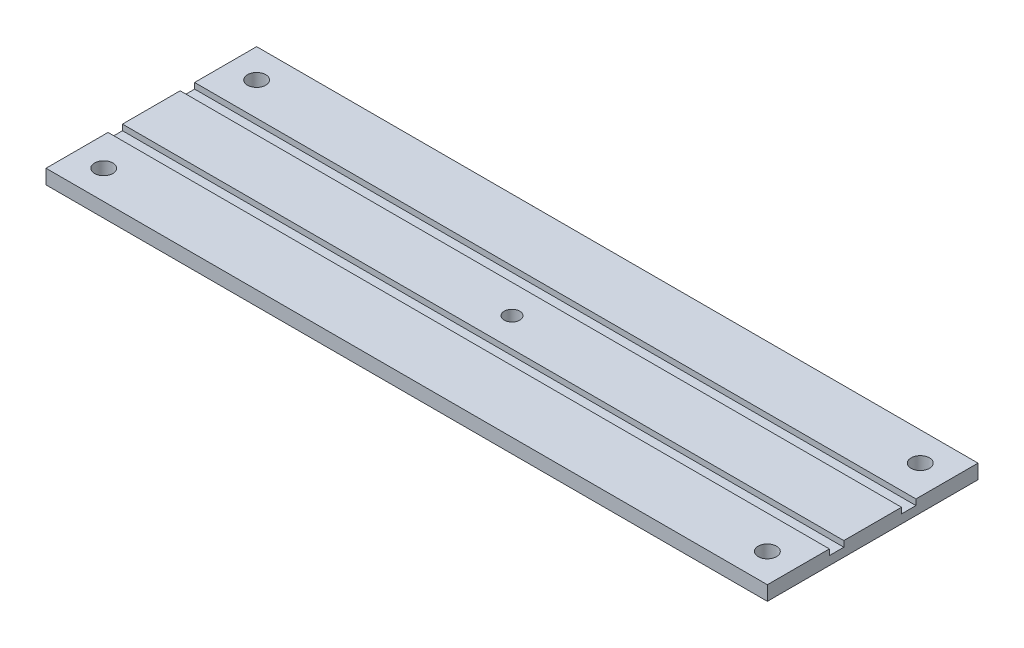
ISO-10303-21;
HEADER;
FILE_DESCRIPTION(('STEP AP214'),'2;1');
FILE_NAME('part.step','',(''),(''),'','','');
FILE_SCHEMA(('AUTOMOTIVE_DESIGN { 1 0 10303 214 1 1 1 1 }'));
ENDSEC;
DATA;
#1=APPLICATION_CONTEXT('core data for automotive mechanical design processes');
#2=APPLICATION_PROTOCOL_DEFINITION('international standard','automotive_design',2000,#1);
#3=PRODUCT_CONTEXT('',#1,'mechanical');
#4=PRODUCT('Part','Part','',(#3));
#5=PRODUCT_RELATED_PRODUCT_CATEGORY('part','',(#4));
#6=PRODUCT_DEFINITION_FORMATION('','',#4);
#7=PRODUCT_DEFINITION_CONTEXT('part definition',#1,'design');
#8=PRODUCT_DEFINITION('design','',#6,#7);
#9=PRODUCT_DEFINITION_SHAPE('','',#8);
#10=(LENGTH_UNIT() NAMED_UNIT(*) SI_UNIT(.MILLI.,.METRE.));
#11=(NAMED_UNIT(*) PLANE_ANGLE_UNIT() SI_UNIT($,.RADIAN.));
#12=(NAMED_UNIT(*) SI_UNIT($,.STERADIAN.) SOLID_ANGLE_UNIT());
#13=UNCERTAINTY_MEASURE_WITH_UNIT(LENGTH_MEASURE(1.E-05),#10,'distance_accuracy_value','');
#14=(GEOMETRIC_REPRESENTATION_CONTEXT(3) GLOBAL_UNCERTAINTY_ASSIGNED_CONTEXT((#13)) GLOBAL_UNIT_ASSIGNED_CONTEXT((#10,
#11,#12)) REPRESENTATION_CONTEXT('',''));
#15=CARTESIAN_POINT('',(0.,0.,0.));
#16=DIRECTION('',(0.,0.,1.));
#17=DIRECTION('',(1.,0.,0.));
#18=AXIS2_PLACEMENT_3D('',#15,#16,#17);
#19=CARTESIAN_POINT('',(0.,5.,0.));
#20=DIRECTION('',(0.,-1.,0.));
#21=DIRECTION('',(0.,0.,-1.));
#22=AXIS2_PLACEMENT_3D('',#19,#20,#21);
#23=PLANE('',#22);
#24=CARTESIAN_POINT('',(10.,5.,-10.));
#25=DIRECTION('',(0.,-1.,0.));
#26=DIRECTION('',(0.,0.,-1.));
#27=AXIS2_PLACEMENT_3D('',#24,#25,#26);
#28=CIRCLE('',#27,3.175);
#29=CARTESIAN_POINT('',(10.,5.,-13.175));
#30=VERTEX_POINT('',#29);
#31=EDGE_CURVE('E182',#30,#30,#28,.T.);
#32=ORIENTED_EDGE('',*,*,#31,.T.);
#33=EDGE_LOOP('',(#32));
#34=FACE_BOUND('',#33,.T.);
#35=CARTESIAN_POINT('',(240.,5.,-10.));
#36=DIRECTION('',(0.,-1.,0.));
#37=DIRECTION('',(0.,0.,-1.));
#38=AXIS2_PLACEMENT_3D('',#35,#36,#37);
#39=CIRCLE('',#38,3.17499999999998);
#40=CARTESIAN_POINT('',(240.,5.,-13.175));
#41=VERTEX_POINT('',#40);
#42=EDGE_CURVE('E200',#41,#41,#39,.T.);
#43=ORIENTED_EDGE('',*,*,#42,.T.);
#44=EDGE_LOOP('',(#43));
#45=FACE_BOUND('',#44,.T.);
#46=DIRECTION('',(0.,0.,-1.));
#47=VECTOR('',#46,1.);
#48=CARTESIAN_POINT('',(250.,5.,0.));
#49=LINE('',#48,#47);
#50=CARTESIAN_POINT('',(250.,5.,0.));
#51=VERTEX_POINT('',#50);
#52=CARTESIAN_POINT('',(250.,5.,-21.5));
#53=VERTEX_POINT('',#52);
#54=EDGE_CURVE('E212',#51,#53,#49,.T.);
#55=ORIENTED_EDGE('',*,*,#54,.T.);
#56=DIRECTION('',(1.,0.,0.));
#57=VECTOR('',#56,1.);
#58=CARTESIAN_POINT('',(250.,5.,-21.5));
#59=LINE('',#58,#57);
#60=CARTESIAN_POINT('',(0.,5.,-21.5));
#61=VERTEX_POINT('',#60);
#62=EDGE_CURVE('E136',#61,#53,#59,.T.);
#63=ORIENTED_EDGE('',*,*,#62,.F.);
#64=DIRECTION('',(0.,0.,1.));
#65=VECTOR('',#64,1.);
#66=CARTESIAN_POINT('',(0.,5.,0.));
#67=LINE('',#66,#65);
#68=CARTESIAN_POINT('',(0.,5.,0.));
#69=VERTEX_POINT('',#68);
#70=EDGE_CURVE('E209',#61,#69,#67,.T.);
#71=ORIENTED_EDGE('',*,*,#70,.T.);
#72=DIRECTION('',(1.,0.,0.));
#73=VECTOR('',#72,1.);
#74=CARTESIAN_POINT('',(0.,5.,0.));
#75=LINE('',#74,#73);
#76=EDGE_CURVE('E207',#69,#51,#75,.T.);
#77=ORIENTED_EDGE('',*,*,#76,.T.);
#78=EDGE_LOOP('',(#55,#63,#71,#77));
#79=FACE_BOUND('',#78,.T.);
#80=ADVANCED_FACE('F32',(#34,#45,#79),#23,.F.);
#81=CARTESIAN_POINT('',(125.,5.,-36.5));
#82=DIRECTION('',(0.,-1.,0.));
#83=DIRECTION('',(0.,0.,-1.));
#84=AXIS2_PLACEMENT_3D('',#81,#82,#83);
#85=CIRCLE('',#84,2.70509999999999);
#86=CARTESIAN_POINT('',(125.,5.,-39.2051));
#87=VERTEX_POINT('',#86);
#88=EDGE_CURVE('E176',#87,#87,#85,.T.);
#89=ORIENTED_EDGE('',*,*,#88,.T.);
#90=EDGE_LOOP('',(#89));
#91=FACE_BOUND('',#90,.T.);
#92=CARTESIAN_POINT('',(0.,5.,-46.5));
#93=VERTEX_POINT('',#92);
#94=CARTESIAN_POINT('',(0.,5.,-26.5));
#95=VERTEX_POINT('',#94);
#96=EDGE_CURVE('E208',#93,#95,#67,.T.);
#97=ORIENTED_EDGE('',*,*,#96,.T.);
#98=DIRECTION('',(-1.,0.,0.));
#99=VECTOR('',#98,1.);
#100=CARTESIAN_POINT('',(250.,5.,-26.5));
#101=LINE('',#100,#99);
#102=CARTESIAN_POINT('',(250.,5.,-26.5));
#103=VERTEX_POINT('',#102);
#104=EDGE_CURVE('E258',#103,#95,#101,.T.);
#105=ORIENTED_EDGE('',*,*,#104,.F.);
#106=CARTESIAN_POINT('',(250.,5.,-46.5));
#107=VERTEX_POINT('',#106);
#108=EDGE_CURVE('E141',#103,#107,#49,.T.);
#109=ORIENTED_EDGE('',*,*,#108,.T.);
#110=DIRECTION('',(1.,0.,0.));
#111=VECTOR('',#110,1.);
#112=CARTESIAN_POINT('',(250.,5.,-46.5));
#113=LINE('',#112,#111);
#114=EDGE_CURVE('E152',#93,#107,#113,.T.);
#115=ORIENTED_EDGE('',*,*,#114,.F.);
#116=EDGE_LOOP('',(#97,#105,#109,#115));
#117=FACE_BOUND('',#116,.T.);
#118=ADVANCED_FACE('F256',(#91,#117),#23,.F.);
#119=CARTESIAN_POINT('',(0.,5.,0.));
#120=DIRECTION('',(1.,0.,0.));
#121=DIRECTION('',(0.,0.,-1.));
#122=AXIS2_PLACEMENT_3D('',#119,#120,#121);
#123=PLANE('',#122);
#124=ORIENTED_EDGE('',*,*,#70,.F.);
#125=DIRECTION('',(0.,1.,0.));
#126=VECTOR('',#125,1.);
#127=CARTESIAN_POINT('',(0.,3.,-21.5));
#128=LINE('',#127,#126);
#129=CARTESIAN_POINT('',(0.,3.,-21.5));
#130=VERTEX_POINT('',#129);
#131=EDGE_CURVE('E143',#130,#61,#128,.T.);
#132=ORIENTED_EDGE('',*,*,#131,.F.);
#133=DIRECTION('',(0.,0.,1.));
#134=VECTOR('',#133,1.);
#135=CARTESIAN_POINT('',(0.,3.,-21.5));
#136=LINE('',#135,#134);
#137=CARTESIAN_POINT('',(0.,3.,-26.5));
#138=VERTEX_POINT('',#137);
#139=EDGE_CURVE('E129',#138,#130,#136,.T.);
#140=ORIENTED_EDGE('',*,*,#139,.F.);
#141=DIRECTION('',(0.,1.,0.));
#142=VECTOR('',#141,1.);
#143=CARTESIAN_POINT('',(0.,3.,-26.5));
#144=LINE('',#143,#142);
#145=EDGE_CURVE('E127',#138,#95,#144,.T.);
#146=ORIENTED_EDGE('',*,*,#145,.T.);
#147=ORIENTED_EDGE('',*,*,#96,.F.);
#148=DIRECTION('',(0.,1.,0.));
#149=VECTOR('',#148,1.);
#150=CARTESIAN_POINT('',(0.,3.,-46.5));
#151=LINE('',#150,#149);
#152=CARTESIAN_POINT('',(0.,3.,-46.5));
#153=VERTEX_POINT('',#152);
#154=EDGE_CURVE('E168',#153,#93,#151,.T.);
#155=ORIENTED_EDGE('',*,*,#154,.F.);
#156=DIRECTION('',(0.,0.,1.));
#157=VECTOR('',#156,1.);
#158=CARTESIAN_POINT('',(0.,3.,-51.5));
#159=LINE('',#158,#157);
#160=CARTESIAN_POINT('',(0.,3.,-51.5));
#161=VERTEX_POINT('',#160);
#162=EDGE_CURVE('E155',#161,#153,#159,.T.);
#163=ORIENTED_EDGE('',*,*,#162,.F.);
#164=DIRECTION('',(0.,1.,0.));
#165=VECTOR('',#164,1.);
#166=CARTESIAN_POINT('',(0.,3.,-51.5));
#167=LINE('',#166,#165);
#168=CARTESIAN_POINT('',(0.,5.,-51.5));
#169=VERTEX_POINT('',#168);
#170=EDGE_CURVE('E170',#161,#169,#167,.T.);
#171=ORIENTED_EDGE('',*,*,#170,.T.);
#172=CARTESIAN_POINT('',(0.,5.,-73.));
#173=VERTEX_POINT('',#172);
#174=EDGE_CURVE('E204',#173,#169,#67,.T.);
#175=ORIENTED_EDGE('',*,*,#174,.F.);
#176=DIRECTION('',(0.,-1.,0.));
#177=VECTOR('',#176,1.);
#178=CARTESIAN_POINT('',(0.,5.,-73.));
#179=LINE('',#178,#177);
#180=CARTESIAN_POINT('',(0.,0.,-73.));
#181=VERTEX_POINT('',#180);
#182=EDGE_CURVE('E217',#173,#181,#179,.T.);
#183=ORIENTED_EDGE('',*,*,#182,.T.);
#184=DIRECTION('',(0.,0.,1.));
#185=VECTOR('',#184,1.);
#186=CARTESIAN_POINT('',(0.,0.,0.));
#187=LINE('',#186,#185);
#188=CARTESIAN_POINT('',(0.,0.,0.));
#189=VERTEX_POINT('',#188);
#190=EDGE_CURVE('E203',#181,#189,#187,.T.);
#191=ORIENTED_EDGE('',*,*,#190,.T.);
#192=DIRECTION('',(0.,-1.,0.));
#193=VECTOR('',#192,1.);
#194=CARTESIAN_POINT('',(0.,5.,0.));
#195=LINE('',#194,#193);
#196=EDGE_CURVE('E11',#69,#189,#195,.T.);
#197=ORIENTED_EDGE('',*,*,#196,.F.);
#198=EDGE_LOOP('',(#124,#132,#140,#146,#147,#155,#163,#171,#175,#183,#191,#197));
#199=FACE_BOUND('',#198,.T.);
#200=ADVANCED_FACE('F34',(#199),#123,.F.);
#201=CARTESIAN_POINT('',(0.,5.,0.));
#202=DIRECTION('',(0.,0.,-1.));
#203=DIRECTION('',(-1.,0.,0.));
#204=AXIS2_PLACEMENT_3D('',#201,#202,#203);
#205=PLANE('',#204);
#206=DIRECTION('',(1.,0.,0.));
#207=VECTOR('',#206,1.);
#208=CARTESIAN_POINT('',(0.,0.,0.));
#209=LINE('',#208,#207);
#210=CARTESIAN_POINT('',(250.,0.,0.));
#211=VERTEX_POINT('',#210);
#212=EDGE_CURVE('E220',#189,#211,#209,.T.);
#213=ORIENTED_EDGE('',*,*,#212,.T.);
#214=DIRECTION('',(0.,-1.,0.));
#215=VECTOR('',#214,1.);
#216=CARTESIAN_POINT('',(250.,5.,0.));
#217=LINE('',#216,#215);
#218=EDGE_CURVE('E40',#51,#211,#217,.T.);
#219=ORIENTED_EDGE('',*,*,#218,.F.);
#220=ORIENTED_EDGE('',*,*,#76,.F.);
#221=ORIENTED_EDGE('',*,*,#196,.T.);
#222=EDGE_LOOP('',(#213,#219,#220,#221));
#223=FACE_BOUND('',#222,.T.);
#224=ADVANCED_FACE('F269',(#223),#205,.F.);
#225=CARTESIAN_POINT('',(250.,5.,0.));
#226=DIRECTION('',(-1.,0.,0.));
#227=DIRECTION('',(0.,0.,1.));
#228=AXIS2_PLACEMENT_3D('',#225,#226,#227);
#229=PLANE('',#228);
#230=DIRECTION('',(0.,0.,-1.));
#231=VECTOR('',#230,1.);
#232=CARTESIAN_POINT('',(250.,3.,-21.5));
#233=LINE('',#232,#231);
#234=CARTESIAN_POINT('',(250.,3.,-21.5));
#235=VERTEX_POINT('',#234);
#236=CARTESIAN_POINT('',(250.,3.,-26.5));
#237=VERTEX_POINT('',#236);
#238=EDGE_CURVE('E130',#235,#237,#233,.T.);
#239=ORIENTED_EDGE('',*,*,#238,.F.);
#240=DIRECTION('',(0.,1.,0.));
#241=VECTOR('',#240,1.);
#242=CARTESIAN_POINT('',(250.,3.,-21.5));
#243=LINE('',#242,#241);
#244=EDGE_CURVE('E162',#235,#53,#243,.T.);
#245=ORIENTED_EDGE('',*,*,#244,.T.);
#246=ORIENTED_EDGE('',*,*,#54,.F.);
#247=ORIENTED_EDGE('',*,*,#218,.T.);
#248=DIRECTION('',(0.,0.,-1.));
#249=VECTOR('',#248,1.);
#250=CARTESIAN_POINT('',(250.,0.,0.));
#251=LINE('',#250,#249);
#252=CARTESIAN_POINT('',(250.,0.,-73.));
#253=VERTEX_POINT('',#252);
#254=EDGE_CURVE('E222',#211,#253,#251,.T.);
#255=ORIENTED_EDGE('',*,*,#254,.T.);
#256=DIRECTION('',(0.,-1.,0.));
#257=VECTOR('',#256,1.);
#258=CARTESIAN_POINT('',(250.,5.,-73.));
#259=LINE('',#258,#257);
#260=CARTESIAN_POINT('',(250.,5.,-73.));
#261=VERTEX_POINT('',#260);
#262=EDGE_CURVE('E228',#261,#253,#259,.T.);
#263=ORIENTED_EDGE('',*,*,#262,.F.);
#264=CARTESIAN_POINT('',(250.,5.,-51.5));
#265=VERTEX_POINT('',#264);
#266=EDGE_CURVE('E211',#265,#261,#49,.T.);
#267=ORIENTED_EDGE('',*,*,#266,.F.);
#268=DIRECTION('',(0.,1.,0.));
#269=VECTOR('',#268,1.);
#270=CARTESIAN_POINT('',(250.,3.,-51.5));
#271=LINE('',#270,#269);
#272=CARTESIAN_POINT('',(250.,3.,-51.5));
#273=VERTEX_POINT('',#272);
#274=EDGE_CURVE('E55',#273,#265,#271,.T.);
#275=ORIENTED_EDGE('',*,*,#274,.F.);
#276=DIRECTION('',(0.,0.,-1.));
#277=VECTOR('',#276,1.);
#278=CARTESIAN_POINT('',(250.,3.,-51.5));
#279=LINE('',#278,#277);
#280=CARTESIAN_POINT('',(250.,3.,-46.5));
#281=VERTEX_POINT('',#280);
#282=EDGE_CURVE('E148',#281,#273,#279,.T.);
#283=ORIENTED_EDGE('',*,*,#282,.F.);
#284=DIRECTION('',(0.,1.,0.));
#285=VECTOR('',#284,1.);
#286=CARTESIAN_POINT('',(250.,3.,-46.5));
#287=LINE('',#286,#285);
#288=EDGE_CURVE('E165',#281,#107,#287,.T.);
#289=ORIENTED_EDGE('',*,*,#288,.T.);
#290=ORIENTED_EDGE('',*,*,#108,.F.);
#291=DIRECTION('',(0.,1.,0.));
#292=VECTOR('',#291,1.);
#293=CARTESIAN_POINT('',(250.,3.,-26.5));
#294=LINE('',#293,#292);
#295=EDGE_CURVE('E124',#237,#103,#294,.T.);
#296=ORIENTED_EDGE('',*,*,#295,.F.);
#297=EDGE_LOOP('',(#239,#245,#246,#247,#255,#263,#267,#275,#283,#289,#290,#296));
#298=FACE_BOUND('',#297,.T.);
#299=ADVANCED_FACE('F139',(#298),#229,.F.);
#300=CARTESIAN_POINT('',(0.,5.,-73.));
#301=DIRECTION('',(0.,0.,1.));
#302=DIRECTION('',(1.,0.,0.));
#303=AXIS2_PLACEMENT_3D('',#300,#301,#302);
#304=PLANE('',#303);
#305=DIRECTION('',(-1.,0.,0.));
#306=VECTOR('',#305,1.);
#307=CARTESIAN_POINT('',(0.,0.,-73.));
#308=LINE('',#307,#306);
#309=EDGE_CURVE('E224',#253,#181,#308,.T.);
#310=ORIENTED_EDGE('',*,*,#309,.T.);
#311=ORIENTED_EDGE('',*,*,#182,.F.);
#312=DIRECTION('',(-1.,0.,0.));
#313=VECTOR('',#312,1.);
#314=CARTESIAN_POINT('',(0.,5.,-73.));
#315=LINE('',#314,#313);
#316=EDGE_CURVE('E215',#261,#173,#315,.T.);
#317=ORIENTED_EDGE('',*,*,#316,.F.);
#318=ORIENTED_EDGE('',*,*,#262,.T.);
#319=EDGE_LOOP('',(#310,#311,#317,#318));
#320=FACE_BOUND('',#319,.T.);
#321=ADVANCED_FACE('F243',(#320),#304,.F.);
#322=CARTESIAN_POINT('',(10.,5.,-63.));
#323=DIRECTION('',(0.,-1.,0.));
#324=DIRECTION('',(0.,0.,-1.));
#325=AXIS2_PLACEMENT_3D('',#322,#323,#324);
#326=CIRCLE('',#325,3.175);
#327=CARTESIAN_POINT('',(10.,5.,-66.175));
#328=VERTEX_POINT('',#327);
#329=EDGE_CURVE('E188',#328,#328,#326,.T.);
#330=ORIENTED_EDGE('',*,*,#329,.T.);
#331=EDGE_LOOP('',(#330));
#332=FACE_BOUND('',#331,.T.);
#333=CARTESIAN_POINT('',(240.,5.,-63.));
#334=DIRECTION('',(0.,-1.,0.));
#335=DIRECTION('',(0.,0.,-1.));
#336=AXIS2_PLACEMENT_3D('',#333,#334,#335);
#337=CIRCLE('',#336,3.17499999999998);
#338=CARTESIAN_POINT('',(240.,5.,-66.175));
#339=VERTEX_POINT('',#338);
#340=EDGE_CURVE('E194',#339,#339,#337,.T.);
#341=ORIENTED_EDGE('',*,*,#340,.T.);
#342=EDGE_LOOP('',(#341));
#343=FACE_BOUND('',#342,.T.);
#344=ORIENTED_EDGE('',*,*,#174,.T.);
#345=DIRECTION('',(-1.,0.,0.));
#346=VECTOR('',#345,1.);
#347=CARTESIAN_POINT('',(250.,5.,-51.5));
#348=LINE('',#347,#346);
#349=EDGE_CURVE('E160',#265,#169,#348,.T.);
#350=ORIENTED_EDGE('',*,*,#349,.F.);
#351=ORIENTED_EDGE('',*,*,#266,.T.);
#352=ORIENTED_EDGE('',*,*,#316,.T.);
#353=EDGE_LOOP('',(#344,#350,#351,#352));
#354=FACE_BOUND('',#353,.T.);
#355=ADVANCED_FACE('F251',(#332,#343,#354),#23,.F.);
#356=CARTESIAN_POINT('',(0.,0.,0.));
#357=DIRECTION('',(0.,-1.,0.));
#358=DIRECTION('',(0.,0.,-1.));
#359=AXIS2_PLACEMENT_3D('',#356,#357,#358);
#360=PLANE('',#359);
#361=CARTESIAN_POINT('',(125.,0.,-36.5));
#362=DIRECTION('',(0.,-1.,0.));
#363=DIRECTION('',(0.,0.,-1.));
#364=AXIS2_PLACEMENT_3D('',#361,#362,#363);
#365=CIRCLE('',#364,2.70509999999999);
#366=CARTESIAN_POINT('',(125.,0.,-39.2051));
#367=VERTEX_POINT('',#366);
#368=EDGE_CURVE('E167',#367,#367,#365,.T.);
#369=ORIENTED_EDGE('',*,*,#368,.F.);
#370=EDGE_LOOP('',(#369));
#371=FACE_BOUND('',#370,.T.);
#372=CARTESIAN_POINT('',(10.,0.,-10.));
#373=DIRECTION('',(0.,-1.,0.));
#374=DIRECTION('',(0.,0.,-1.));
#375=AXIS2_PLACEMENT_3D('',#372,#373,#374);
#376=CIRCLE('',#375,3.17499999999999);
#377=CARTESIAN_POINT('',(10.,0.,-13.175));
#378=VERTEX_POINT('',#377);
#379=EDGE_CURVE('E179',#378,#378,#376,.T.);
#380=ORIENTED_EDGE('',*,*,#379,.F.);
#381=EDGE_LOOP('',(#380));
#382=FACE_BOUND('',#381,.T.);
#383=CARTESIAN_POINT('',(10.,0.,-63.));
#384=DIRECTION('',(0.,-1.,0.));
#385=DIRECTION('',(0.,0.,-1.));
#386=AXIS2_PLACEMENT_3D('',#383,#384,#385);
#387=CIRCLE('',#386,3.17499999999999);
#388=CARTESIAN_POINT('',(10.,0.,-66.175));
#389=VERTEX_POINT('',#388);
#390=EDGE_CURVE('E185',#389,#389,#387,.T.);
#391=ORIENTED_EDGE('',*,*,#390,.F.);
#392=EDGE_LOOP('',(#391));
#393=FACE_BOUND('',#392,.T.);
#394=CARTESIAN_POINT('',(240.,0.,-63.));
#395=DIRECTION('',(0.,-1.,0.));
#396=DIRECTION('',(0.,0.,-1.));
#397=AXIS2_PLACEMENT_3D('',#394,#395,#396);
#398=CIRCLE('',#397,3.17499999999998);
#399=CARTESIAN_POINT('',(240.,0.,-66.175));
#400=VERTEX_POINT('',#399);
#401=EDGE_CURVE('E191',#400,#400,#398,.T.);
#402=ORIENTED_EDGE('',*,*,#401,.F.);
#403=EDGE_LOOP('',(#402));
#404=FACE_BOUND('',#403,.T.);
#405=CARTESIAN_POINT('',(240.,0.,-10.));
#406=DIRECTION('',(0.,-1.,0.));
#407=DIRECTION('',(0.,0.,-1.));
#408=AXIS2_PLACEMENT_3D('',#405,#406,#407);
#409=CIRCLE('',#408,3.17499999999998);
#410=CARTESIAN_POINT('',(240.,0.,-13.175));
#411=VERTEX_POINT('',#410);
#412=EDGE_CURVE('E197',#411,#411,#409,.T.);
#413=ORIENTED_EDGE('',*,*,#412,.F.);
#414=EDGE_LOOP('',(#413));
#415=FACE_BOUND('',#414,.T.);
#416=ORIENTED_EDGE('',*,*,#190,.F.);
#417=ORIENTED_EDGE('',*,*,#309,.F.);
#418=ORIENTED_EDGE('',*,*,#254,.F.);
#419=ORIENTED_EDGE('',*,*,#212,.F.);
#420=EDGE_LOOP('',(#416,#417,#418,#419));
#421=FACE_BOUND('',#420,.T.);
#422=ADVANCED_FACE('F240',(#371,#382,#393,#404,#415,#421),#360,.T.);
#423=CARTESIAN_POINT('',(240.,0.,-10.));
#424=DIRECTION('',(0.,-1.,0.));
#425=DIRECTION('',(0.,0.,-1.));
#426=AXIS2_PLACEMENT_3D('',#423,#424,#425);
#427=CYLINDRICAL_SURFACE('',#426,3.17499999999998);
#428=ORIENTED_EDGE('',*,*,#42,.F.);
#429=EDGE_LOOP('',(#428));
#430=FACE_BOUND('',#429,.T.);
#431=ORIENTED_EDGE('',*,*,#412,.T.);
#432=EDGE_LOOP('',(#431));
#433=FACE_BOUND('',#432,.T.);
#434=ADVANCED_FACE('F292',(#430,#433),#427,.F.);
#435=CARTESIAN_POINT('',(240.,0.,-63.));
#436=DIRECTION('',(0.,-1.,0.));
#437=DIRECTION('',(0.,0.,-1.));
#438=AXIS2_PLACEMENT_3D('',#435,#436,#437);
#439=CYLINDRICAL_SURFACE('',#438,3.17499999999998);
#440=ORIENTED_EDGE('',*,*,#340,.F.);
#441=EDGE_LOOP('',(#440));
#442=FACE_BOUND('',#441,.T.);
#443=ORIENTED_EDGE('',*,*,#401,.T.);
#444=EDGE_LOOP('',(#443));
#445=FACE_BOUND('',#444,.T.);
#446=ADVANCED_FACE('F299',(#442,#445),#439,.F.);
#447=CARTESIAN_POINT('',(10.,0.,-63.));
#448=DIRECTION('',(0.,-1.,0.));
#449=DIRECTION('',(0.,0.,-1.));
#450=AXIS2_PLACEMENT_3D('',#447,#448,#449);
#451=CYLINDRICAL_SURFACE('',#450,3.17499999999999);
#452=ORIENTED_EDGE('',*,*,#329,.F.);
#453=EDGE_LOOP('',(#452));
#454=FACE_BOUND('',#453,.T.);
#455=ORIENTED_EDGE('',*,*,#390,.T.);
#456=EDGE_LOOP('',(#455));
#457=FACE_BOUND('',#456,.T.);
#458=ADVANCED_FACE('F302',(#454,#457),#451,.F.);
#459=CARTESIAN_POINT('',(10.,0.,-10.));
#460=DIRECTION('',(0.,-1.,0.));
#461=DIRECTION('',(0.,0.,-1.));
#462=AXIS2_PLACEMENT_3D('',#459,#460,#461);
#463=CYLINDRICAL_SURFACE('',#462,3.17499999999999);
#464=ORIENTED_EDGE('',*,*,#31,.F.);
#465=EDGE_LOOP('',(#464));
#466=FACE_BOUND('',#465,.T.);
#467=ORIENTED_EDGE('',*,*,#379,.T.);
#468=EDGE_LOOP('',(#467));
#469=FACE_BOUND('',#468,.T.);
#470=ADVANCED_FACE('F317',(#466,#469),#463,.F.);
#471=CARTESIAN_POINT('',(125.,0.,-36.5));
#472=DIRECTION('',(0.,-1.,0.));
#473=DIRECTION('',(0.,0.,-1.));
#474=AXIS2_PLACEMENT_3D('',#471,#472,#473);
#475=CYLINDRICAL_SURFACE('',#474,2.70509999999999);
#476=ORIENTED_EDGE('',*,*,#88,.F.);
#477=EDGE_LOOP('',(#476));
#478=FACE_BOUND('',#477,.T.);
#479=ORIENTED_EDGE('',*,*,#368,.T.);
#480=EDGE_LOOP('',(#479));
#481=FACE_BOUND('',#480,.T.);
#482=ADVANCED_FACE('F321',(#478,#481),#475,.F.);
#483=CARTESIAN_POINT('',(250.,3.,-46.5));
#484=DIRECTION('',(0.,0.,1.));
#485=DIRECTION('',(1.,0.,0.));
#486=AXIS2_PLACEMENT_3D('',#483,#484,#485);
#487=PLANE('',#486);
#488=ORIENTED_EDGE('',*,*,#114,.T.);
#489=ORIENTED_EDGE('',*,*,#288,.F.);
#490=DIRECTION('',(1.,0.,0.));
#491=VECTOR('',#490,1.);
#492=CARTESIAN_POINT('',(250.,3.,-46.5));
#493=LINE('',#492,#491);
#494=EDGE_CURVE('E157',#153,#281,#493,.T.);
#495=ORIENTED_EDGE('',*,*,#494,.F.);
#496=ORIENTED_EDGE('',*,*,#154,.T.);
#497=EDGE_LOOP('',(#488,#489,#495,#496));
#498=FACE_BOUND('',#497,.T.);
#499=ADVANCED_FACE('F260',(#498),#487,.F.);
#500=CARTESIAN_POINT('',(250.,3.,-51.5));
#501=DIRECTION('',(0.,0.,-1.));
#502=DIRECTION('',(-1.,0.,0.));
#503=AXIS2_PLACEMENT_3D('',#500,#501,#502);
#504=PLANE('',#503);
#505=ORIENTED_EDGE('',*,*,#349,.T.);
#506=ORIENTED_EDGE('',*,*,#170,.F.);
#507=DIRECTION('',(-1.,0.,0.));
#508=VECTOR('',#507,1.);
#509=CARTESIAN_POINT('',(250.,3.,-51.5));
#510=LINE('',#509,#508);
#511=EDGE_CURVE('E151',#273,#161,#510,.T.);
#512=ORIENTED_EDGE('',*,*,#511,.F.);
#513=ORIENTED_EDGE('',*,*,#274,.T.);
#514=EDGE_LOOP('',(#505,#506,#512,#513));
#515=FACE_BOUND('',#514,.T.);
#516=ADVANCED_FACE('F326',(#515),#504,.F.);
#517=CARTESIAN_POINT('',(0.,3.,0.));
#518=DIRECTION('',(0.,-1.,0.));
#519=DIRECTION('',(0.,0.,-1.));
#520=AXIS2_PLACEMENT_3D('',#517,#518,#519);
#521=PLANE('',#520);
#522=ORIENTED_EDGE('',*,*,#282,.T.);
#523=ORIENTED_EDGE('',*,*,#511,.T.);
#524=ORIENTED_EDGE('',*,*,#162,.T.);
#525=ORIENTED_EDGE('',*,*,#494,.T.);
#526=EDGE_LOOP('',(#522,#523,#524,#525));
#527=FACE_BOUND('',#526,.T.);
#528=ADVANCED_FACE('F265',(#527),#521,.F.);
#529=CARTESIAN_POINT('',(250.,3.,-21.5));
#530=DIRECTION('',(0.,0.,1.));
#531=DIRECTION('',(1.,0.,0.));
#532=AXIS2_PLACEMENT_3D('',#529,#530,#531);
#533=PLANE('',#532);
#534=ORIENTED_EDGE('',*,*,#62,.T.);
#535=ORIENTED_EDGE('',*,*,#244,.F.);
#536=DIRECTION('',(1.,0.,0.));
#537=VECTOR('',#536,1.);
#538=CARTESIAN_POINT('',(250.,3.,-21.5));
#539=LINE('',#538,#537);
#540=EDGE_CURVE('E47',#130,#235,#539,.T.);
#541=ORIENTED_EDGE('',*,*,#540,.F.);
#542=ORIENTED_EDGE('',*,*,#131,.T.);
#543=EDGE_LOOP('',(#534,#535,#541,#542));
#544=FACE_BOUND('',#543,.T.);
#545=ADVANCED_FACE('F333',(#544),#533,.F.);
#546=CARTESIAN_POINT('',(250.,3.,-26.5));
#547=DIRECTION('',(0.,0.,-1.));
#548=DIRECTION('',(-1.,0.,0.));
#549=AXIS2_PLACEMENT_3D('',#546,#547,#548);
#550=PLANE('',#549);
#551=ORIENTED_EDGE('',*,*,#104,.T.);
#552=ORIENTED_EDGE('',*,*,#145,.F.);
#553=DIRECTION('',(-1.,0.,0.));
#554=VECTOR('',#553,1.);
#555=CARTESIAN_POINT('',(250.,3.,-26.5));
#556=LINE('',#555,#554);
#557=EDGE_CURVE('E121',#237,#138,#556,.T.);
#558=ORIENTED_EDGE('',*,*,#557,.F.);
#559=ORIENTED_EDGE('',*,*,#295,.T.);
#560=EDGE_LOOP('',(#551,#552,#558,#559));
#561=FACE_BOUND('',#560,.T.);
#562=ADVANCED_FACE('F122',(#561),#550,.F.);
#563=CARTESIAN_POINT('',(0.,3.,0.));
#564=DIRECTION('',(0.,1.,0.));
#565=DIRECTION('',(0.,0.,1.));
#566=AXIS2_PLACEMENT_3D('',#563,#564,#565);
#567=PLANE('',#566);
#568=ORIENTED_EDGE('',*,*,#238,.T.);
#569=ORIENTED_EDGE('',*,*,#557,.T.);
#570=ORIENTED_EDGE('',*,*,#139,.T.);
#571=ORIENTED_EDGE('',*,*,#540,.T.);
#572=EDGE_LOOP('',(#568,#569,#570,#571));
#573=FACE_BOUND('',#572,.T.);
#574=ADVANCED_FACE('F133',(#573),#567,.T.);
#575=CLOSED_SHELL('',(#80,#118,#200,#224,#299,#321,#355,#422,#434,#446,#458,#470,#482,#499,#516,
#528,#545,#562,#574));
#576=MANIFOLD_SOLID_BREP('B2',#575);
#577=ADVANCED_BREP_SHAPE_REPRESENTATION('',(#18,#576),#14);
#578=SHAPE_DEFINITION_REPRESENTATION(#9,#577);
ENDSEC;
END-ISO-10303-21;
